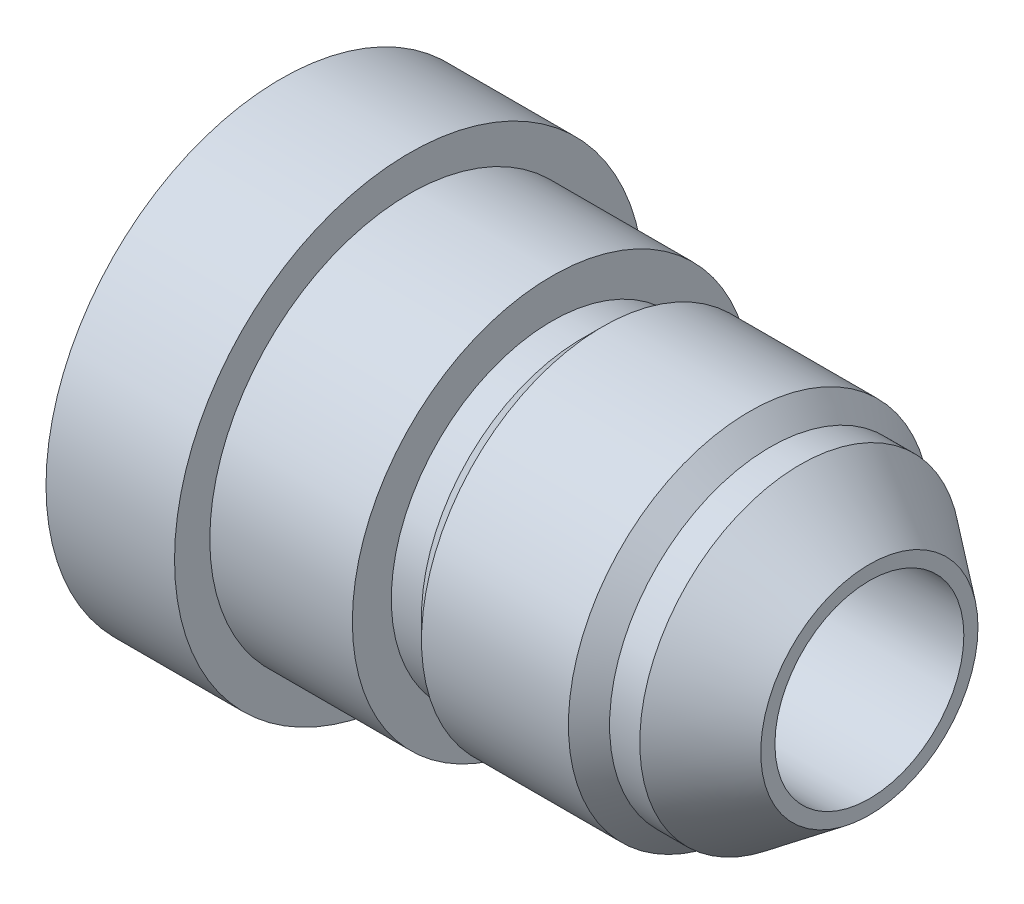
ISO-10303-21;
HEADER;
FILE_DESCRIPTION(('STEP AP214'),'2;1');
FILE_NAME('part.step','',(''),(''),'','','');
FILE_SCHEMA(('AUTOMOTIVE_DESIGN { 1 0 10303 214 1 1 1 1 }'));
ENDSEC;
DATA;
#1=APPLICATION_CONTEXT('core data for automotive mechanical design processes');
#2=APPLICATION_PROTOCOL_DEFINITION('international standard','automotive_design',2000,#1);
#3=PRODUCT_CONTEXT('',#1,'mechanical');
#4=PRODUCT('Part','Part','',(#3));
#5=PRODUCT_RELATED_PRODUCT_CATEGORY('part','',(#4));
#6=PRODUCT_DEFINITION_FORMATION('','',#4);
#7=PRODUCT_DEFINITION_CONTEXT('part definition',#1,'design');
#8=PRODUCT_DEFINITION('design','',#6,#7);
#9=PRODUCT_DEFINITION_SHAPE('','',#8);
#10=(LENGTH_UNIT() NAMED_UNIT(*) SI_UNIT(.MILLI.,.METRE.));
#11=(NAMED_UNIT(*) PLANE_ANGLE_UNIT() SI_UNIT($,.RADIAN.));
#12=(NAMED_UNIT(*) SI_UNIT($,.STERADIAN.) SOLID_ANGLE_UNIT());
#13=UNCERTAINTY_MEASURE_WITH_UNIT(LENGTH_MEASURE(1.E-05),#10,'distance_accuracy_value','');
#14=(GEOMETRIC_REPRESENTATION_CONTEXT(3) GLOBAL_UNCERTAINTY_ASSIGNED_CONTEXT((#13)) GLOBAL_UNIT_ASSIGNED_CONTEXT((#10,
#11,#12)) REPRESENTATION_CONTEXT('',''));
#15=CARTESIAN_POINT('',(0.,0.,0.));
#16=DIRECTION('',(0.,0.,1.));
#17=DIRECTION('',(1.,0.,0.));
#18=AXIS2_PLACEMENT_3D('',#15,#16,#17);
#19=CARTESIAN_POINT('',(-15.4686,0.,0.));
#20=DIRECTION('',(-1.,0.,0.));
#21=DIRECTION('',(0.,0.,1.));
#22=AXIS2_PLACEMENT_3D('',#19,#20,#21);
#23=CYLINDRICAL_SURFACE('',#22,9.525);
#24=CARTESIAN_POINT('',(1.45021149638085,0.,0.));
#25=DIRECTION('',(1.,0.,0.));
#26=DIRECTION('',(0.,0.,-1.));
#27=AXIS2_PLACEMENT_3D('',#24,#25,#26);
#28=CIRCLE('',#27,9.525);
#29=CARTESIAN_POINT('',(1.45021149638085,0.,-9.525));
#30=VERTEX_POINT('',#29);
#31=EDGE_CURVE('E77',#30,#30,#28,.T.);
#32=ORIENTED_EDGE('',*,*,#31,.T.);
#33=EDGE_LOOP('',(#32));
#34=FACE_BOUND('',#33,.T.);
#35=CARTESIAN_POINT('',(9.17299406773704,0.,0.));
#36=DIRECTION('',(1.,0.,0.));
#37=DIRECTION('',(0.,0.,-1.));
#38=AXIS2_PLACEMENT_3D('',#35,#36,#37);
#39=CIRCLE('',#38,9.525);
#40=CARTESIAN_POINT('',(9.17299406773704,0.,-9.525));
#41=VERTEX_POINT('',#40);
#42=EDGE_CURVE('E74',#41,#41,#39,.T.);
#43=ORIENTED_EDGE('',*,*,#42,.F.);
#44=EDGE_LOOP('',(#43));
#45=FACE_BOUND('',#44,.T.);
#46=ADVANCED_FACE('F36',(#34,#45),#23,.T.);
#47=CARTESIAN_POINT('',(15.4686,4.9657,0.));
#48=DIRECTION('',(-1.,0.,0.));
#49=DIRECTION('',(0.,0.,1.));
#50=AXIS2_PLACEMENT_3D('',#47,#48,#49);
#51=PLANE('',#50);
#52=CARTESIAN_POINT('',(15.4686,0.,0.));
#53=DIRECTION('',(1.,0.,0.));
#54=DIRECTION('',(0.,0.,-1.));
#55=AXIS2_PLACEMENT_3D('',#52,#53,#54);
#56=CIRCLE('',#55,5.710555);
#57=CARTESIAN_POINT('',(15.4686,0.,-5.710555));
#58=VERTEX_POINT('',#57);
#59=EDGE_CURVE('E65',#58,#58,#56,.T.);
#60=ORIENTED_EDGE('',*,*,#59,.T.);
#61=EDGE_LOOP('',(#60));
#62=FACE_BOUND('',#61,.T.);
#63=CARTESIAN_POINT('',(15.4686,0.,0.));
#64=DIRECTION('',(-1.,0.,0.));
#65=DIRECTION('',(0.,0.,1.));
#66=AXIS2_PLACEMENT_3D('',#63,#64,#65);
#67=CIRCLE('',#66,4.9657);
#68=CARTESIAN_POINT('',(15.4686,0.,4.9657));
#69=VERTEX_POINT('',#68);
#70=EDGE_CURVE('E51',#69,#69,#67,.T.);
#71=ORIENTED_EDGE('',*,*,#70,.T.);
#72=EDGE_LOOP('',(#71));
#73=FACE_BOUND('',#72,.T.);
#74=ADVANCED_FACE('F108',(#62,#73),#51,.F.);
#75=CARTESIAN_POINT('',(-15.4686,0.,0.));
#76=DIRECTION('',(-1.,0.,0.));
#77=DIRECTION('',(0.,0.,1.));
#78=AXIS2_PLACEMENT_3D('',#75,#76,#77);
#79=CYLINDRICAL_SURFACE('',#78,12.3444);
#80=CARTESIAN_POINT('',(-15.4686,0.,0.));
#81=DIRECTION('',(-1.,0.,0.));
#82=DIRECTION('',(0.,0.,1.));
#83=AXIS2_PLACEMENT_3D('',#80,#81,#82);
#84=CIRCLE('',#83,12.3444);
#85=CARTESIAN_POINT('',(-15.4686,0.,12.3444));
#86=VERTEX_POINT('',#85);
#87=EDGE_CURVE('E62',#86,#86,#84,.T.);
#88=ORIENTED_EDGE('',*,*,#87,.F.);
#89=EDGE_LOOP('',(#88));
#90=FACE_BOUND('',#89,.T.);
#91=CARTESIAN_POINT('',(-8.7122,0.,0.));
#92=DIRECTION('',(-1.,0.,0.));
#93=DIRECTION('',(0.,0.,1.));
#94=AXIS2_PLACEMENT_3D('',#91,#92,#93);
#95=CIRCLE('',#94,12.3444);
#96=CARTESIAN_POINT('',(-8.7122,0.,12.3444));
#97=VERTEX_POINT('',#96);
#98=EDGE_CURVE('E10',#97,#97,#95,.T.);
#99=ORIENTED_EDGE('',*,*,#98,.T.);
#100=EDGE_LOOP('',(#99));
#101=FACE_BOUND('',#100,.T.);
#102=ADVANCED_FACE('F38',(#90,#101),#79,.T.);
#103=CARTESIAN_POINT('',(-8.7122,12.3444,0.));
#104=DIRECTION('',(-1.,0.,0.));
#105=DIRECTION('',(0.,0.,1.));
#106=AXIS2_PLACEMENT_3D('',#103,#104,#105);
#107=PLANE('',#106);
#108=ORIENTED_EDGE('',*,*,#98,.F.);
#109=EDGE_LOOP('',(#108));
#110=FACE_BOUND('',#109,.T.);
#111=CARTESIAN_POINT('',(-8.7122,0.,0.));
#112=DIRECTION('',(-1.,0.,0.));
#113=DIRECTION('',(0.,0.,1.));
#114=AXIS2_PLACEMENT_3D('',#111,#112,#113);
#115=CIRCLE('',#114,10.4902);
#116=CARTESIAN_POINT('',(-8.7122,0.,10.4902));
#117=VERTEX_POINT('',#116);
#118=EDGE_CURVE('E43',#117,#117,#115,.T.);
#119=ORIENTED_EDGE('',*,*,#118,.T.);
#120=EDGE_LOOP('',(#119));
#121=FACE_BOUND('',#120,.T.);
#122=ADVANCED_FACE('F102',(#110,#121),#107,.F.);
#123=CARTESIAN_POINT('',(-15.4686,0.,0.));
#124=DIRECTION('',(-1.,0.,0.));
#125=DIRECTION('',(0.,0.,1.));
#126=AXIS2_PLACEMENT_3D('',#123,#124,#125);
#127=CYLINDRICAL_SURFACE('',#126,10.4902);
#128=ORIENTED_EDGE('',*,*,#118,.F.);
#129=EDGE_LOOP('',(#128));
#130=FACE_BOUND('',#129,.T.);
#131=CARTESIAN_POINT('',(-1.2192,0.,0.));
#132=DIRECTION('',(-1.,0.,0.));
#133=DIRECTION('',(0.,0.,1.));
#134=AXIS2_PLACEMENT_3D('',#131,#132,#133);
#135=CIRCLE('',#134,10.4902);
#136=CARTESIAN_POINT('',(-1.2192,0.,10.4902));
#137=VERTEX_POINT('',#136);
#138=EDGE_CURVE('E47',#137,#137,#135,.T.);
#139=ORIENTED_EDGE('',*,*,#138,.T.);
#140=EDGE_LOOP('',(#139));
#141=FACE_BOUND('',#140,.T.);
#142=ADVANCED_FACE('F92',(#130,#141),#127,.T.);
#143=CARTESIAN_POINT('',(-1.2192,10.4902,0.));
#144=DIRECTION('',(-1.,0.,0.));
#145=DIRECTION('',(0.,0.,1.));
#146=AXIS2_PLACEMENT_3D('',#143,#144,#145);
#147=PLANE('',#146);
#148=ORIENTED_EDGE('',*,*,#138,.F.);
#149=EDGE_LOOP('',(#148));
#150=FACE_BOUND('',#149,.T.);
#151=CARTESIAN_POINT('',(-1.2192,0.,0.));
#152=DIRECTION('',(1.,0.,0.));
#153=DIRECTION('',(0.,0.,-1.));
#154=AXIS2_PLACEMENT_3D('',#151,#152,#153);
#155=CIRCLE('',#154,8.44308850361914);
#156=CARTESIAN_POINT('',(-1.2192,0.,-8.44308850361914));
#157=VERTEX_POINT('',#156);
#158=EDGE_CURVE('E83',#157,#157,#155,.T.);
#159=ORIENTED_EDGE('',*,*,#158,.F.);
#160=EDGE_LOOP('',(#159));
#161=FACE_BOUND('',#160,.T.);
#162=ADVANCED_FACE('F89',(#150,#161),#147,.F.);
#163=CARTESIAN_POINT('',(-15.4686,0.,0.));
#164=DIRECTION('',(-1.,0.,0.));
#165=DIRECTION('',(0.,0.,1.));
#166=AXIS2_PLACEMENT_3D('',#163,#164,#165);
#167=CYLINDRICAL_SURFACE('',#166,4.9657);
#168=ORIENTED_EDGE('',*,*,#70,.F.);
#169=EDGE_LOOP('',(#168));
#170=FACE_BOUND('',#169,.T.);
#171=CARTESIAN_POINT('',(-7.22725354429066,0.,0.));
#172=DIRECTION('',(-1.,0.,0.));
#173=DIRECTION('',(0.,0.,1.));
#174=AXIS2_PLACEMENT_3D('',#171,#172,#173);
#175=CIRCLE('',#174,4.9657);
#176=CARTESIAN_POINT('',(-7.22725354429066,0.,4.9657));
#177=VERTEX_POINT('',#176);
#178=EDGE_CURVE('E56',#177,#177,#175,.T.);
#179=ORIENTED_EDGE('',*,*,#178,.T.);
#180=EDGE_LOOP('',(#179));
#181=FACE_BOUND('',#180,.T.);
#182=ADVANCED_FACE('F91',(#170,#181),#167,.F.);
#183=CARTESIAN_POINT('',(-15.4686,0.,0.));
#184=DIRECTION('',(-1.,0.,0.));
#185=DIRECTION('',(0.,0.,1.));
#186=AXIS2_PLACEMENT_3D('',#183,#184,#185);
#187=CONICAL_SURFACE('',#186,11.176,0.645771823237896);
#188=ORIENTED_EDGE('',*,*,#178,.F.);
#189=EDGE_LOOP('',(#188));
#190=FACE_BOUND('',#189,.T.);
#191=CARTESIAN_POINT('',(-15.4686,0.,0.));
#192=DIRECTION('',(-1.,0.,0.));
#193=DIRECTION('',(0.,0.,1.));
#194=AXIS2_PLACEMENT_3D('',#191,#192,#193);
#195=CIRCLE('',#194,11.176);
#196=CARTESIAN_POINT('',(-15.4686,0.,11.176));
#197=VERTEX_POINT('',#196);
#198=EDGE_CURVE('E59',#197,#197,#195,.T.);
#199=ORIENTED_EDGE('',*,*,#198,.T.);
#200=EDGE_LOOP('',(#199));
#201=FACE_BOUND('',#200,.T.);
#202=ADVANCED_FACE('F99',(#190,#201),#187,.F.);
#203=CARTESIAN_POINT('',(-15.4686,12.3444,0.));
#204=DIRECTION('',(1.,0.,0.));
#205=DIRECTION('',(0.,0.,-1.));
#206=AXIS2_PLACEMENT_3D('',#203,#204,#205);
#207=PLANE('',#206);
#208=ORIENTED_EDGE('',*,*,#198,.F.);
#209=EDGE_LOOP('',(#208));
#210=FACE_BOUND('',#209,.T.);
#211=ORIENTED_EDGE('',*,*,#87,.T.);
#212=EDGE_LOOP('',(#211));
#213=FACE_BOUND('',#212,.T.);
#214=ADVANCED_FACE('F119',(#210,#213),#207,.F.);
#215=CARTESIAN_POINT('',(11.8424055641179,0.,0.));
#216=DIRECTION('',(-1.,0.,0.));
#217=DIRECTION('',(0.,0.,1.));
#218=AXIS2_PLACEMENT_3D('',#215,#216,#217);
#219=CONICAL_SURFACE('',#218,8.44308850361915,0.645771823237896);
#220=ORIENTED_EDGE('',*,*,#59,.F.);
#221=EDGE_LOOP('',(#220));
#222=FACE_BOUND('',#221,.T.);
#223=CARTESIAN_POINT('',(11.8424055641179,0.,0.));
#224=DIRECTION('',(1.,0.,0.));
#225=DIRECTION('',(0.,0.,-1.));
#226=AXIS2_PLACEMENT_3D('',#223,#224,#225);
#227=CIRCLE('',#226,8.44308850361915);
#228=CARTESIAN_POINT('',(11.8424055641179,0.,-8.44308850361915));
#229=VERTEX_POINT('',#228);
#230=EDGE_CURVE('E68',#229,#229,#227,.T.);
#231=ORIENTED_EDGE('',*,*,#230,.T.);
#232=EDGE_LOOP('',(#231));
#233=FACE_BOUND('',#232,.T.);
#234=ADVANCED_FACE('F123',(#222,#233),#219,.T.);
#235=CARTESIAN_POINT('',(0.,0.,0.));
#236=DIRECTION('',(1.,0.,0.));
#237=DIRECTION('',(0.,0.,-1.));
#238=AXIS2_PLACEMENT_3D('',#235,#236,#237);
#239=CYLINDRICAL_SURFACE('',#238,8.44308850361915);
#240=ORIENTED_EDGE('',*,*,#230,.F.);
#241=EDGE_LOOP('',(#240));
#242=FACE_BOUND('',#241,.T.);
#243=CARTESIAN_POINT('',(10.2549055641179,0.,0.));
#244=DIRECTION('',(1.,0.,0.));
#245=DIRECTION('',(0.,0.,-1.));
#246=AXIS2_PLACEMENT_3D('',#243,#244,#245);
#247=CIRCLE('',#246,8.44308850361915);
#248=CARTESIAN_POINT('',(10.2549055641179,0.,-8.44308850361915));
#249=VERTEX_POINT('',#248);
#250=EDGE_CURVE('E71',#249,#249,#247,.T.);
#251=ORIENTED_EDGE('',*,*,#250,.T.);
#252=EDGE_LOOP('',(#251));
#253=FACE_BOUND('',#252,.T.);
#254=ADVANCED_FACE('F127',(#242,#253),#239,.T.);
#255=CARTESIAN_POINT('',(9.17299406773704,0.,0.));
#256=DIRECTION('',(-1.,0.,0.));
#257=DIRECTION('',(0.,0.,1.));
#258=AXIS2_PLACEMENT_3D('',#255,#256,#257);
#259=CONICAL_SURFACE('',#258,9.525,0.785398163397449);
#260=ORIENTED_EDGE('',*,*,#42,.T.);
#261=EDGE_LOOP('',(#260));
#262=FACE_BOUND('',#261,.T.);
#263=ORIENTED_EDGE('',*,*,#250,.F.);
#264=EDGE_LOOP('',(#263));
#265=FACE_BOUND('',#264,.T.);
#266=ADVANCED_FACE('F131',(#262,#265),#259,.T.);
#267=CARTESIAN_POINT('',(0.368299999999999,0.,0.));
#268=DIRECTION('',(1.,0.,0.));
#269=DIRECTION('',(0.,0.,-1.));
#270=AXIS2_PLACEMENT_3D('',#267,#268,#269);
#271=CONICAL_SURFACE('',#270,8.44308850361914,0.78539816339745);
#272=ORIENTED_EDGE('',*,*,#31,.F.);
#273=EDGE_LOOP('',(#272));
#274=FACE_BOUND('',#273,.T.);
#275=CARTESIAN_POINT('',(0.368299999999999,0.,0.));
#276=DIRECTION('',(1.,0.,0.));
#277=DIRECTION('',(0.,0.,-1.));
#278=AXIS2_PLACEMENT_3D('',#275,#276,#277);
#279=CIRCLE('',#278,8.44308850361914);
#280=CARTESIAN_POINT('',(0.368299999999999,0.,-8.44308850361914));
#281=VERTEX_POINT('',#280);
#282=EDGE_CURVE('E80',#281,#281,#279,.T.);
#283=ORIENTED_EDGE('',*,*,#282,.T.);
#284=EDGE_LOOP('',(#283));
#285=FACE_BOUND('',#284,.T.);
#286=ADVANCED_FACE('F135',(#274,#285),#271,.T.);
#287=CARTESIAN_POINT('',(0.,0.,0.));
#288=DIRECTION('',(1.,0.,0.));
#289=DIRECTION('',(0.,0.,-1.));
#290=AXIS2_PLACEMENT_3D('',#287,#288,#289);
#291=CYLINDRICAL_SURFACE('',#290,8.44308850361914);
#292=ORIENTED_EDGE('',*,*,#282,.F.);
#293=EDGE_LOOP('',(#292));
#294=FACE_BOUND('',#293,.T.);
#295=ORIENTED_EDGE('',*,*,#158,.T.);
#296=EDGE_LOOP('',(#295));
#297=FACE_BOUND('',#296,.T.);
#298=ADVANCED_FACE('F87',(#294,#297),#291,.T.);
#299=CLOSED_SHELL('',(#46,#74,#102,#122,#142,#162,#182,#202,#214,#234,#254,#266,#286,#298));
#300=MANIFOLD_SOLID_BREP('B2',#299);
#301=ADVANCED_BREP_SHAPE_REPRESENTATION('',(#18,#300),#14);
#302=SHAPE_DEFINITION_REPRESENTATION(#9,#301);
ENDSEC;
END-ISO-10303-21;
